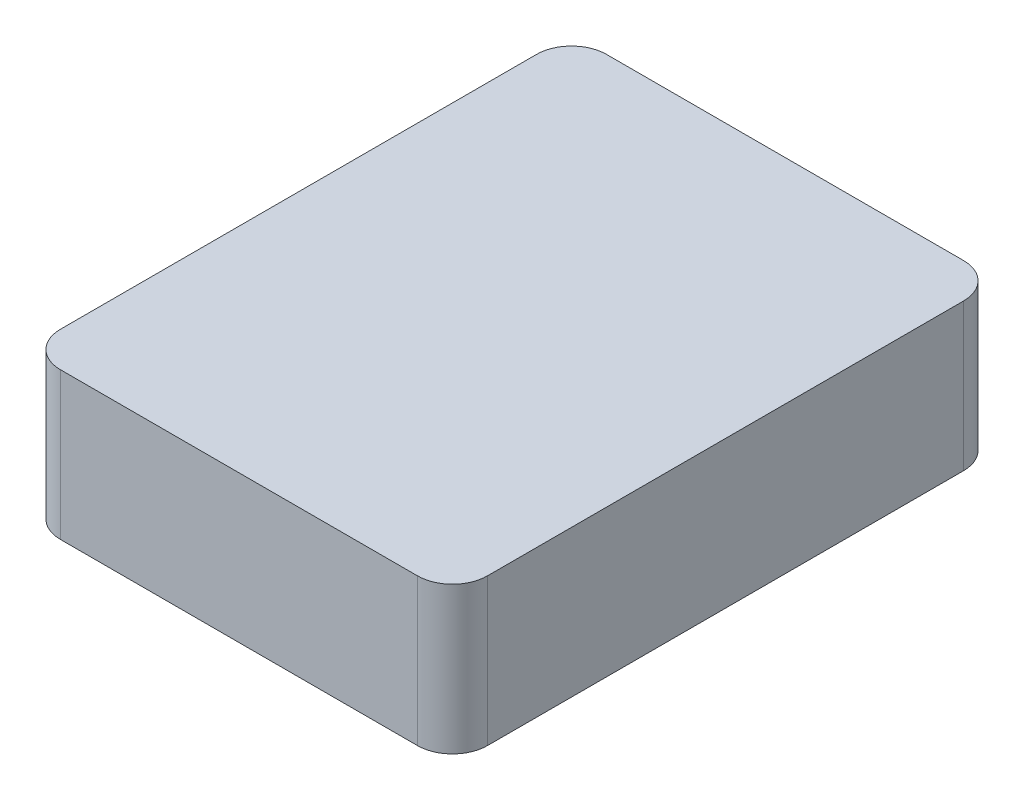
ISO-10303-21;
HEADER;
FILE_DESCRIPTION(('STEP AP214'),'2;1');
FILE_NAME('part.step','',(''),(''),'','','');
FILE_SCHEMA(('AUTOMOTIVE_DESIGN { 1 0 10303 214 1 1 1 1 }'));
ENDSEC;
DATA;
#1=APPLICATION_CONTEXT('core data for automotive mechanical design processes');
#2=APPLICATION_PROTOCOL_DEFINITION('international standard','automotive_design',2000,#1);
#3=PRODUCT_CONTEXT('',#1,'mechanical');
#4=PRODUCT('Part','Part','',(#3));
#5=PRODUCT_RELATED_PRODUCT_CATEGORY('part','',(#4));
#6=PRODUCT_DEFINITION_FORMATION('','',#4);
#7=PRODUCT_DEFINITION_CONTEXT('part definition',#1,'design');
#8=PRODUCT_DEFINITION('design','',#6,#7);
#9=PRODUCT_DEFINITION_SHAPE('','',#8);
#10=(LENGTH_UNIT() NAMED_UNIT(*) SI_UNIT(.MILLI.,.METRE.));
#11=(NAMED_UNIT(*) PLANE_ANGLE_UNIT() SI_UNIT($,.RADIAN.));
#12=(NAMED_UNIT(*) SI_UNIT($,.STERADIAN.) SOLID_ANGLE_UNIT());
#13=UNCERTAINTY_MEASURE_WITH_UNIT(LENGTH_MEASURE(1.E-05),#10,'distance_accuracy_value','');
#14=(GEOMETRIC_REPRESENTATION_CONTEXT(3) GLOBAL_UNCERTAINTY_ASSIGNED_CONTEXT((#13)) GLOBAL_UNIT_ASSIGNED_CONTEXT((#10,
#11,#12)) REPRESENTATION_CONTEXT('',''));
#15=CARTESIAN_POINT('',(0.,0.,0.));
#16=DIRECTION('',(0.,0.,1.));
#17=DIRECTION('',(1.,0.,0.));
#18=AXIS2_PLACEMENT_3D('',#15,#16,#17);
#19=CARTESIAN_POINT('',(0.,21.,0.));
#20=DIRECTION('',(1.,0.,0.));
#21=DIRECTION('',(0.,0.,-1.));
#22=AXIS2_PLACEMENT_3D('',#19,#20,#21);
#23=PLANE('',#22);
#24=DIRECTION('',(0.,0.,1.));
#25=VECTOR('',#24,1.);
#26=CARTESIAN_POINT('',(0.,21.,0.));
#27=LINE('',#26,#25);
#28=CARTESIAN_POINT('',(0.,21.,-73.));
#29=VERTEX_POINT('',#28);
#30=CARTESIAN_POINT('',(0.,21.,-5.));
#31=VERTEX_POINT('',#30);
#32=EDGE_CURVE('E118',#29,#31,#27,.T.);
#33=ORIENTED_EDGE('',*,*,#32,.F.);
#34=DIRECTION('',(0.,-1.,0.));
#35=VECTOR('',#34,1.);
#36=CARTESIAN_POINT('',(0.,21.,-73.));
#37=LINE('',#36,#35);
#38=CARTESIAN_POINT('',(0.,0.,-73.));
#39=VERTEX_POINT('',#38);
#40=EDGE_CURVE('E103',#29,#39,#37,.T.);
#41=ORIENTED_EDGE('',*,*,#40,.T.);
#42=DIRECTION('',(0.,0.,1.));
#43=VECTOR('',#42,1.);
#44=CARTESIAN_POINT('',(0.,0.,0.));
#45=LINE('',#44,#43);
#46=CARTESIAN_POINT('',(0.,0.,-5.));
#47=VERTEX_POINT('',#46);
#48=EDGE_CURVE('E115',#39,#47,#45,.T.);
#49=ORIENTED_EDGE('',*,*,#48,.T.);
#50=DIRECTION('',(0.,-1.,0.));
#51=VECTOR('',#50,1.);
#52=CARTESIAN_POINT('',(0.,21.,-5.));
#53=LINE('',#52,#51);
#54=EDGE_CURVE('E120',#47,#31,#53,.F.);
#55=ORIENTED_EDGE('',*,*,#54,.T.);
#56=EDGE_LOOP('',(#33,#41,#49,#55));
#57=FACE_BOUND('',#56,.T.);
#58=ADVANCED_FACE('F33',(#57),#23,.F.);
#59=CARTESIAN_POINT('',(0.,21.,0.));
#60=DIRECTION('',(0.,0.,-1.));
#61=DIRECTION('',(-1.,0.,0.));
#62=AXIS2_PLACEMENT_3D('',#59,#60,#61);
#63=PLANE('',#62);
#64=DIRECTION('',(1.,0.,0.));
#65=VECTOR('',#64,1.);
#66=CARTESIAN_POINT('',(0.,0.,0.));
#67=LINE('',#66,#65);
#68=CARTESIAN_POINT('',(5.,0.,0.));
#69=VERTEX_POINT('',#68);
#70=CARTESIAN_POINT('',(56.,0.,0.));
#71=VERTEX_POINT('',#70);
#72=EDGE_CURVE('E124',#69,#71,#67,.T.);
#73=ORIENTED_EDGE('',*,*,#72,.T.);
#74=DIRECTION('',(0.,-1.,0.));
#75=VECTOR('',#74,1.);
#76=CARTESIAN_POINT('',(56.,21.,0.));
#77=LINE('',#76,#75);
#78=CARTESIAN_POINT('',(56.,21.,0.));
#79=VERTEX_POINT('',#78);
#80=EDGE_CURVE('E11',#71,#79,#77,.F.);
#81=ORIENTED_EDGE('',*,*,#80,.T.);
#82=DIRECTION('',(1.,0.,0.));
#83=VECTOR('',#82,1.);
#84=CARTESIAN_POINT('',(0.,21.,0.));
#85=LINE('',#84,#83);
#86=CARTESIAN_POINT('',(5.,21.,0.));
#87=VERTEX_POINT('',#86);
#88=EDGE_CURVE('E160',#87,#79,#85,.T.);
#89=ORIENTED_EDGE('',*,*,#88,.F.);
#90=DIRECTION('',(0.,-1.,0.));
#91=VECTOR('',#90,1.);
#92=CARTESIAN_POINT('',(5.,21.,0.));
#93=LINE('',#92,#91);
#94=EDGE_CURVE('E41',#87,#69,#93,.T.);
#95=ORIENTED_EDGE('',*,*,#94,.T.);
#96=EDGE_LOOP('',(#73,#81,#89,#95));
#97=FACE_BOUND('',#96,.T.);
#98=ADVANCED_FACE('F158',(#97),#63,.F.);
#99=CARTESIAN_POINT('',(61.,21.,0.));
#100=DIRECTION('',(-1.,0.,0.));
#101=DIRECTION('',(0.,0.,1.));
#102=AXIS2_PLACEMENT_3D('',#99,#100,#101);
#103=PLANE('',#102);
#104=DIRECTION('',(0.,0.,-1.));
#105=VECTOR('',#104,1.);
#106=CARTESIAN_POINT('',(61.,0.,0.));
#107=LINE('',#106,#105);
#108=CARTESIAN_POINT('',(61.,0.,-5.));
#109=VERTEX_POINT('',#108);
#110=CARTESIAN_POINT('',(61.,0.,-73.));
#111=VERTEX_POINT('',#110);
#112=EDGE_CURVE('E127',#109,#111,#107,.T.);
#113=ORIENTED_EDGE('',*,*,#112,.T.);
#114=DIRECTION('',(0.,-1.,0.));
#115=VECTOR('',#114,1.);
#116=CARTESIAN_POINT('',(61.,21.,-73.));
#117=LINE('',#116,#115);
#118=CARTESIAN_POINT('',(61.,21.,-73.));
#119=VERTEX_POINT('',#118);
#120=EDGE_CURVE('E48',#111,#119,#117,.F.);
#121=ORIENTED_EDGE('',*,*,#120,.T.);
#122=DIRECTION('',(0.,0.,-1.));
#123=VECTOR('',#122,1.);
#124=CARTESIAN_POINT('',(61.,21.,0.));
#125=LINE('',#124,#123);
#126=CARTESIAN_POINT('',(61.,21.,-5.));
#127=VERTEX_POINT('',#126);
#128=EDGE_CURVE('E168',#127,#119,#125,.T.);
#129=ORIENTED_EDGE('',*,*,#128,.F.);
#130=DIRECTION('',(0.,-1.,0.));
#131=VECTOR('',#130,1.);
#132=CARTESIAN_POINT('',(61.,21.,-5.));
#133=LINE('',#132,#131);
#134=EDGE_CURVE('E151',#127,#109,#133,.T.);
#135=ORIENTED_EDGE('',*,*,#134,.T.);
#136=EDGE_LOOP('',(#113,#121,#129,#135));
#137=FACE_BOUND('',#136,.T.);
#138=ADVANCED_FACE('F167',(#137),#103,.F.);
#139=CARTESIAN_POINT('',(0.,21.,-78.));
#140=DIRECTION('',(0.,0.,1.));
#141=DIRECTION('',(1.,0.,0.));
#142=AXIS2_PLACEMENT_3D('',#139,#140,#141);
#143=PLANE('',#142);
#144=DIRECTION('',(-1.,0.,0.));
#145=VECTOR('',#144,1.);
#146=CARTESIAN_POINT('',(0.,0.,-78.));
#147=LINE('',#146,#145);
#148=CARTESIAN_POINT('',(56.,0.,-78.));
#149=VERTEX_POINT('',#148);
#150=CARTESIAN_POINT('',(5.,0.,-78.));
#151=VERTEX_POINT('',#150);
#152=EDGE_CURVE('E134',#149,#151,#147,.T.);
#153=ORIENTED_EDGE('',*,*,#152,.T.);
#154=DIRECTION('',(0.,-1.,0.));
#155=VECTOR('',#154,1.);
#156=CARTESIAN_POINT('',(5.,21.,-78.));
#157=LINE('',#156,#155);
#158=CARTESIAN_POINT('',(5.,21.,-78.));
#159=VERTEX_POINT('',#158);
#160=EDGE_CURVE('E104',#151,#159,#157,.F.);
#161=ORIENTED_EDGE('',*,*,#160,.T.);
#162=DIRECTION('',(-1.,0.,0.));
#163=VECTOR('',#162,1.);
#164=CARTESIAN_POINT('',(0.,21.,-78.));
#165=LINE('',#164,#163);
#166=CARTESIAN_POINT('',(56.,21.,-78.));
#167=VERTEX_POINT('',#166);
#168=EDGE_CURVE('E130',#167,#159,#165,.T.);
#169=ORIENTED_EDGE('',*,*,#168,.F.);
#170=DIRECTION('',(0.,-1.,0.));
#171=VECTOR('',#170,1.);
#172=CARTESIAN_POINT('',(56.,21.,-78.));
#173=LINE('',#172,#171);
#174=EDGE_CURVE('E109',#167,#149,#173,.T.);
#175=ORIENTED_EDGE('',*,*,#174,.T.);
#176=EDGE_LOOP('',(#153,#161,#169,#175));
#177=FACE_BOUND('',#176,.T.);
#178=ADVANCED_FACE('F196',(#177),#143,.F.);
#179=CARTESIAN_POINT('',(0.,21.,0.));
#180=DIRECTION('',(0.,-1.,0.));
#181=DIRECTION('',(0.,0.,-1.));
#182=AXIS2_PLACEMENT_3D('',#179,#180,#181);
#183=PLANE('',#182);
#184=ORIENTED_EDGE('',*,*,#168,.T.);
#185=CARTESIAN_POINT('',(5.,21.,-73.));
#186=DIRECTION('',(0.,-1.,0.));
#187=DIRECTION('',(0.,0.,-1.));
#188=AXIS2_PLACEMENT_3D('',#185,#186,#187);
#189=CIRCLE('',#188,5.);
#190=EDGE_CURVE('E149',#159,#29,#189,.F.);
#191=ORIENTED_EDGE('',*,*,#190,.T.);
#192=ORIENTED_EDGE('',*,*,#32,.T.);
#193=CARTESIAN_POINT('',(5.,21.,-5.));
#194=DIRECTION('',(0.,-1.,0.));
#195=DIRECTION('',(0.,0.,-1.));
#196=AXIS2_PLACEMENT_3D('',#193,#194,#195);
#197=CIRCLE('',#196,5.);
#198=EDGE_CURVE('E144',#31,#87,#197,.F.);
#199=ORIENTED_EDGE('',*,*,#198,.T.);
#200=ORIENTED_EDGE('',*,*,#88,.T.);
#201=CARTESIAN_POINT('',(56.,21.,-5.));
#202=DIRECTION('',(0.,-1.,0.));
#203=DIRECTION('',(0.,0.,-1.));
#204=AXIS2_PLACEMENT_3D('',#201,#202,#203);
#205=CIRCLE('',#204,5.);
#206=EDGE_CURVE('E55',#79,#127,#205,.F.);
#207=ORIENTED_EDGE('',*,*,#206,.T.);
#208=ORIENTED_EDGE('',*,*,#128,.T.);
#209=CARTESIAN_POINT('',(56.,21.,-73.));
#210=DIRECTION('',(0.,-1.,0.));
#211=DIRECTION('',(0.,0.,-1.));
#212=AXIS2_PLACEMENT_3D('',#209,#210,#211);
#213=CIRCLE('',#212,5.);
#214=EDGE_CURVE('E147',#119,#167,#213,.F.);
#215=ORIENTED_EDGE('',*,*,#214,.T.);
#216=EDGE_LOOP('',(#184,#191,#192,#199,#200,#207,#208,#215));
#217=FACE_BOUND('',#216,.T.);
#218=ADVANCED_FACE('F173',(#217),#183,.F.);
#219=CARTESIAN_POINT('',(0.,0.,0.));
#220=DIRECTION('',(0.,-1.,0.));
#221=DIRECTION('',(0.,0.,-1.));
#222=AXIS2_PLACEMENT_3D('',#219,#220,#221);
#223=PLANE('',#222);
#224=ORIENTED_EDGE('',*,*,#48,.F.);
#225=CARTESIAN_POINT('',(5.,0.,-73.));
#226=DIRECTION('',(0.,-1.,0.));
#227=DIRECTION('',(0.,0.,-1.));
#228=AXIS2_PLACEMENT_3D('',#225,#226,#227);
#229=CIRCLE('',#228,5.);
#230=EDGE_CURVE('E99',#39,#151,#229,.T.);
#231=ORIENTED_EDGE('',*,*,#230,.T.);
#232=ORIENTED_EDGE('',*,*,#152,.F.);
#233=CARTESIAN_POINT('',(56.,0.,-73.));
#234=DIRECTION('',(0.,-1.,0.));
#235=DIRECTION('',(0.,0.,-1.));
#236=AXIS2_PLACEMENT_3D('',#233,#234,#235);
#237=CIRCLE('',#236,5.);
#238=EDGE_CURVE('E110',#149,#111,#237,.T.);
#239=ORIENTED_EDGE('',*,*,#238,.T.);
#240=ORIENTED_EDGE('',*,*,#112,.F.);
#241=CARTESIAN_POINT('',(56.,0.,-5.));
#242=DIRECTION('',(0.,-1.,0.));
#243=DIRECTION('',(0.,0.,-1.));
#244=AXIS2_PLACEMENT_3D('',#241,#242,#243);
#245=CIRCLE('',#244,5.);
#246=EDGE_CURVE('E138',#109,#71,#245,.T.);
#247=ORIENTED_EDGE('',*,*,#246,.T.);
#248=ORIENTED_EDGE('',*,*,#72,.F.);
#249=CARTESIAN_POINT('',(5.,0.,-5.));
#250=DIRECTION('',(0.,-1.,0.));
#251=DIRECTION('',(0.,0.,-1.));
#252=AXIS2_PLACEMENT_3D('',#249,#250,#251);
#253=CIRCLE('',#252,5.);
#254=EDGE_CURVE('E119',#69,#47,#253,.T.);
#255=ORIENTED_EDGE('',*,*,#254,.T.);
#256=EDGE_LOOP('',(#224,#231,#232,#239,#240,#247,#248,#255));
#257=FACE_BOUND('',#256,.T.);
#258=ADVANCED_FACE('F122',(#257),#223,.T.);
#259=CARTESIAN_POINT('',(5.,21.,-73.));
#260=DIRECTION('',(0.,-1.,0.));
#261=DIRECTION('',(0.,0.,-1.));
#262=AXIS2_PLACEMENT_3D('',#259,#260,#261);
#263=CYLINDRICAL_SURFACE('',#262,5.);
#264=ORIENTED_EDGE('',*,*,#190,.F.);
#265=ORIENTED_EDGE('',*,*,#160,.F.);
#266=ORIENTED_EDGE('',*,*,#230,.F.);
#267=ORIENTED_EDGE('',*,*,#40,.F.);
#268=EDGE_LOOP('',(#264,#265,#266,#267));
#269=FACE_BOUND('',#268,.T.);
#270=ADVANCED_FACE('F102',(#269),#263,.T.);
#271=CARTESIAN_POINT('',(56.,21.,-73.));
#272=DIRECTION('',(0.,-1.,0.));
#273=DIRECTION('',(0.,0.,-1.));
#274=AXIS2_PLACEMENT_3D('',#271,#272,#273);
#275=CYLINDRICAL_SURFACE('',#274,5.);
#276=ORIENTED_EDGE('',*,*,#214,.F.);
#277=ORIENTED_EDGE('',*,*,#120,.F.);
#278=ORIENTED_EDGE('',*,*,#238,.F.);
#279=ORIENTED_EDGE('',*,*,#174,.F.);
#280=EDGE_LOOP('',(#276,#277,#278,#279));
#281=FACE_BOUND('',#280,.T.);
#282=ADVANCED_FACE('F178',(#281),#275,.T.);
#283=CARTESIAN_POINT('',(56.,21.,-5.));
#284=DIRECTION('',(0.,-1.,0.));
#285=DIRECTION('',(0.,0.,-1.));
#286=AXIS2_PLACEMENT_3D('',#283,#284,#285);
#287=CYLINDRICAL_SURFACE('',#286,5.);
#288=ORIENTED_EDGE('',*,*,#206,.F.);
#289=ORIENTED_EDGE('',*,*,#80,.F.);
#290=ORIENTED_EDGE('',*,*,#246,.F.);
#291=ORIENTED_EDGE('',*,*,#134,.F.);
#292=EDGE_LOOP('',(#288,#289,#290,#291));
#293=FACE_BOUND('',#292,.T.);
#294=ADVANCED_FACE('F166',(#293),#287,.T.);
#295=CARTESIAN_POINT('',(5.,21.,-5.));
#296=DIRECTION('',(0.,-1.,0.));
#297=DIRECTION('',(0.,0.,-1.));
#298=AXIS2_PLACEMENT_3D('',#295,#296,#297);
#299=CYLINDRICAL_SURFACE('',#298,5.);
#300=ORIENTED_EDGE('',*,*,#198,.F.);
#301=ORIENTED_EDGE('',*,*,#54,.F.);
#302=ORIENTED_EDGE('',*,*,#254,.F.);
#303=ORIENTED_EDGE('',*,*,#94,.F.);
#304=EDGE_LOOP('',(#300,#301,#302,#303));
#305=FACE_BOUND('',#304,.T.);
#306=ADVANCED_FACE('F35',(#305),#299,.T.);
#307=CLOSED_SHELL('',(#58,#98,#138,#178,#218,#258,#270,#282,#294,#306));
#308=MANIFOLD_SOLID_BREP('B2',#307);
#309=ADVANCED_BREP_SHAPE_REPRESENTATION('',(#18,#308),#14);
#310=SHAPE_DEFINITION_REPRESENTATION(#9,#309);
ENDSEC;
END-ISO-10303-21;
